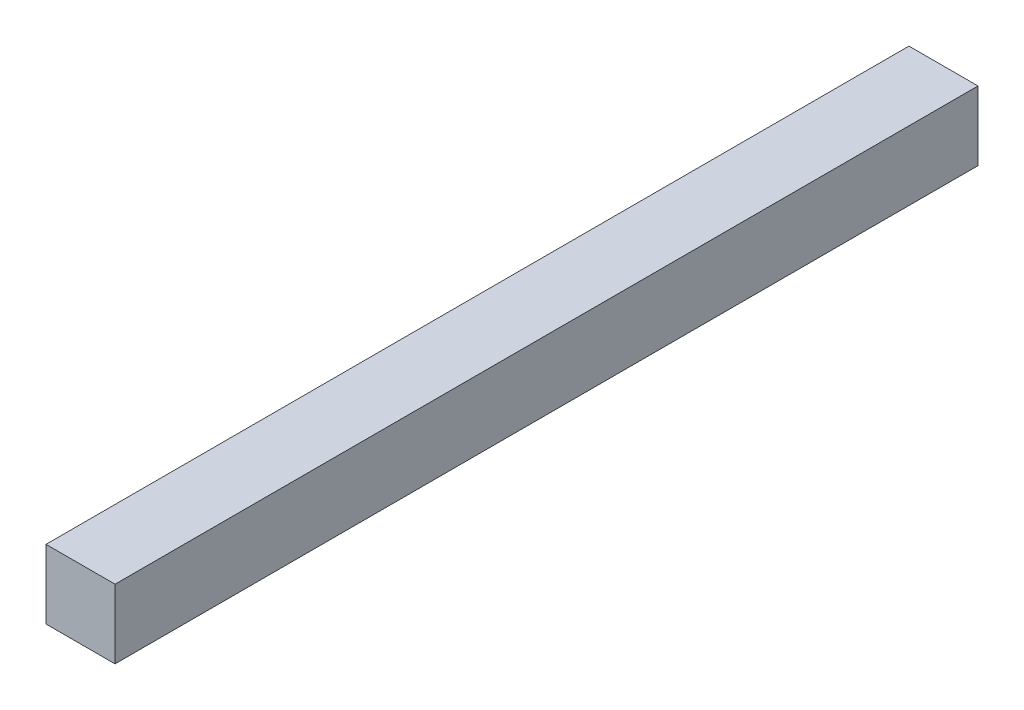
ISO-10303-21;
HEADER;
FILE_DESCRIPTION(('STEP AP214'),'2;1');
FILE_NAME('part.step','',(''),(''),'','','');
FILE_SCHEMA(('AUTOMOTIVE_DESIGN { 1 0 10303 214 1 1 1 1 }'));
ENDSEC;
DATA;
#1=APPLICATION_CONTEXT('core data for automotive mechanical design processes');
#2=APPLICATION_PROTOCOL_DEFINITION('international standard','automotive_design',2000,#1);
#3=PRODUCT_CONTEXT('',#1,'mechanical');
#4=PRODUCT('Part','Part','',(#3));
#5=PRODUCT_RELATED_PRODUCT_CATEGORY('part','',(#4));
#6=PRODUCT_DEFINITION_FORMATION('','',#4);
#7=PRODUCT_DEFINITION_CONTEXT('part definition',#1,'design');
#8=PRODUCT_DEFINITION('design','',#6,#7);
#9=PRODUCT_DEFINITION_SHAPE('','',#8);
#10=(LENGTH_UNIT() NAMED_UNIT(*) SI_UNIT(.MILLI.,.METRE.));
#11=(NAMED_UNIT(*) PLANE_ANGLE_UNIT() SI_UNIT($,.RADIAN.));
#12=(NAMED_UNIT(*) SI_UNIT($,.STERADIAN.) SOLID_ANGLE_UNIT());
#13=UNCERTAINTY_MEASURE_WITH_UNIT(LENGTH_MEASURE(1.E-05),#10,'distance_accuracy_value','');
#14=(GEOMETRIC_REPRESENTATION_CONTEXT(3) GLOBAL_UNCERTAINTY_ASSIGNED_CONTEXT((#13)) GLOBAL_UNIT_ASSIGNED_CONTEXT((#10,
#11,#12)) REPRESENTATION_CONTEXT('',''));
#15=CARTESIAN_POINT('',(0.,0.,0.));
#16=DIRECTION('',(0.,0.,1.));
#17=DIRECTION('',(1.,0.,0.));
#18=AXIS2_PLACEMENT_3D('',#15,#16,#17);
#19=CARTESIAN_POINT('',(8.,-8.,200.));
#20=DIRECTION('',(-1.,0.,0.));
#21=DIRECTION('',(0.,0.,1.));
#22=AXIS2_PLACEMENT_3D('',#19,#20,#21);
#23=PLANE('',#22);
#24=DIRECTION('',(0.,1.,0.));
#25=VECTOR('',#24,1.);
#26=CARTESIAN_POINT('',(8.,-8.,0.));
#27=LINE('',#26,#25);
#28=CARTESIAN_POINT('',(8.,-8.,0.));
#29=VERTEX_POINT('',#28);
#30=CARTESIAN_POINT('',(8.,8.,0.));
#31=VERTEX_POINT('',#30);
#32=EDGE_CURVE('E105',#29,#31,#27,.T.);
#33=ORIENTED_EDGE('',*,*,#32,.T.);
#34=DIRECTION('',(0.,0.,-1.));
#35=VECTOR('',#34,1.);
#36=CARTESIAN_POINT('',(8.,8.,200.));
#37=LINE('',#36,#35);
#38=CARTESIAN_POINT('',(8.,8.,200.));
#39=VERTEX_POINT('',#38);
#40=EDGE_CURVE('E11',#39,#31,#37,.T.);
#41=ORIENTED_EDGE('',*,*,#40,.F.);
#42=DIRECTION('',(0.,1.,0.));
#43=VECTOR('',#42,1.);
#44=CARTESIAN_POINT('',(8.,-8.,200.));
#45=LINE('',#44,#43);
#46=CARTESIAN_POINT('',(8.,-8.,200.));
#47=VERTEX_POINT('',#46);
#48=EDGE_CURVE('E89',#47,#39,#45,.T.);
#49=ORIENTED_EDGE('',*,*,#48,.F.);
#50=DIRECTION('',(0.,0.,-1.));
#51=VECTOR('',#50,1.);
#52=CARTESIAN_POINT('',(8.,-8.,200.));
#53=LINE('',#52,#51);
#54=EDGE_CURVE('E97',#47,#29,#53,.T.);
#55=ORIENTED_EDGE('',*,*,#54,.T.);
#56=EDGE_LOOP('',(#33,#41,#49,#55));
#57=FACE_BOUND('',#56,.T.);
#58=ADVANCED_FACE('F39',(#57),#23,.F.);
#59=CARTESIAN_POINT('',(-8.,8.,200.));
#60=DIRECTION('',(0.,-1.,0.));
#61=DIRECTION('',(0.,0.,-1.));
#62=AXIS2_PLACEMENT_3D('',#59,#60,#61);
#63=PLANE('',#62);
#64=DIRECTION('',(-1.,0.,0.));
#65=VECTOR('',#64,1.);
#66=CARTESIAN_POINT('',(-8.,8.,0.));
#67=LINE('',#66,#65);
#68=CARTESIAN_POINT('',(-8.,8.,0.));
#69=VERTEX_POINT('',#68);
#70=EDGE_CURVE('E92',#31,#69,#67,.T.);
#71=ORIENTED_EDGE('',*,*,#70,.T.);
#72=DIRECTION('',(0.,0.,-1.));
#73=VECTOR('',#72,1.);
#74=CARTESIAN_POINT('',(-8.,8.,200.));
#75=LINE('',#74,#73);
#76=CARTESIAN_POINT('',(-8.,8.,200.));
#77=VERTEX_POINT('',#76);
#78=EDGE_CURVE('E50',#77,#69,#75,.T.);
#79=ORIENTED_EDGE('',*,*,#78,.F.);
#80=DIRECTION('',(-1.,0.,0.));
#81=VECTOR('',#80,1.);
#82=CARTESIAN_POINT('',(-8.,8.,200.));
#83=LINE('',#82,#81);
#84=EDGE_CURVE('E82',#39,#77,#83,.T.);
#85=ORIENTED_EDGE('',*,*,#84,.F.);
#86=ORIENTED_EDGE('',*,*,#40,.T.);
#87=EDGE_LOOP('',(#71,#79,#85,#86));
#88=FACE_BOUND('',#87,.T.);
#89=ADVANCED_FACE('F93',(#88),#63,.F.);
#90=CARTESIAN_POINT('',(-8.,-8.,200.));
#91=DIRECTION('',(1.,0.,0.));
#92=DIRECTION('',(0.,0.,-1.));
#93=AXIS2_PLACEMENT_3D('',#90,#91,#92);
#94=PLANE('',#93);
#95=DIRECTION('',(0.,-1.,0.));
#96=VECTOR('',#95,1.);
#97=CARTESIAN_POINT('',(-8.,-8.,0.));
#98=LINE('',#97,#96);
#99=CARTESIAN_POINT('',(-8.,-8.,0.));
#100=VERTEX_POINT('',#99);
#101=EDGE_CURVE('E72',#69,#100,#98,.T.);
#102=ORIENTED_EDGE('',*,*,#101,.T.);
#103=DIRECTION('',(0.,0.,-1.));
#104=VECTOR('',#103,1.);
#105=CARTESIAN_POINT('',(-8.,-8.,200.));
#106=LINE('',#105,#104);
#107=CARTESIAN_POINT('',(-8.,-8.,200.));
#108=VERTEX_POINT('',#107);
#109=EDGE_CURVE('E94',#108,#100,#106,.T.);
#110=ORIENTED_EDGE('',*,*,#109,.F.);
#111=DIRECTION('',(0.,-1.,0.));
#112=VECTOR('',#111,1.);
#113=CARTESIAN_POINT('',(-8.,-8.,200.));
#114=LINE('',#113,#112);
#115=EDGE_CURVE('E88',#77,#108,#114,.T.);
#116=ORIENTED_EDGE('',*,*,#115,.F.);
#117=ORIENTED_EDGE('',*,*,#78,.T.);
#118=EDGE_LOOP('',(#102,#110,#116,#117));
#119=FACE_BOUND('',#118,.T.);
#120=ADVANCED_FACE('F96',(#119),#94,.F.);
#121=CARTESIAN_POINT('',(-8.,-8.,200.));
#122=DIRECTION('',(0.,1.,0.));
#123=DIRECTION('',(0.,0.,1.));
#124=AXIS2_PLACEMENT_3D('',#121,#122,#123);
#125=PLANE('',#124);
#126=DIRECTION('',(1.,0.,0.));
#127=VECTOR('',#126,1.);
#128=CARTESIAN_POINT('',(-8.,-8.,0.));
#129=LINE('',#128,#127);
#130=EDGE_CURVE('E76',#100,#29,#129,.T.);
#131=ORIENTED_EDGE('',*,*,#130,.T.);
#132=ORIENTED_EDGE('',*,*,#54,.F.);
#133=DIRECTION('',(1.,0.,0.));
#134=VECTOR('',#133,1.);
#135=CARTESIAN_POINT('',(-8.,-8.,200.));
#136=LINE('',#135,#134);
#137=EDGE_CURVE('E54',#108,#47,#136,.T.);
#138=ORIENTED_EDGE('',*,*,#137,.F.);
#139=ORIENTED_EDGE('',*,*,#109,.T.);
#140=EDGE_LOOP('',(#131,#132,#138,#139));
#141=FACE_BOUND('',#140,.T.);
#142=ADVANCED_FACE('F108',(#141),#125,.F.);
#143=CARTESIAN_POINT('',(0.,0.,200.));
#144=DIRECTION('',(0.,0.,-1.));
#145=DIRECTION('',(-1.,0.,0.));
#146=AXIS2_PLACEMENT_3D('',#143,#144,#145);
#147=PLANE('',#146);
#148=ORIENTED_EDGE('',*,*,#48,.T.);
#149=ORIENTED_EDGE('',*,*,#84,.T.);
#150=ORIENTED_EDGE('',*,*,#115,.T.);
#151=ORIENTED_EDGE('',*,*,#137,.T.);
#152=EDGE_LOOP('',(#148,#149,#150,#151));
#153=FACE_BOUND('',#152,.T.);
#154=ADVANCED_FACE('F86',(#153),#147,.F.);
#155=CARTESIAN_POINT('',(0.,0.,0.));
#156=DIRECTION('',(0.,0.,-1.));
#157=DIRECTION('',(-1.,0.,0.));
#158=AXIS2_PLACEMENT_3D('',#155,#156,#157);
#159=PLANE('',#158);
#160=ORIENTED_EDGE('',*,*,#32,.F.);
#161=ORIENTED_EDGE('',*,*,#130,.F.);
#162=ORIENTED_EDGE('',*,*,#101,.F.);
#163=ORIENTED_EDGE('',*,*,#70,.F.);
#164=EDGE_LOOP('',(#160,#161,#162,#163));
#165=FACE_BOUND('',#164,.T.);
#166=ADVANCED_FACE('F115',(#165),#159,.T.);
#167=CLOSED_SHELL('',(#58,#89,#120,#142,#154,#166));
#168=MANIFOLD_SOLID_BREP('B2',#167);
#169=ADVANCED_BREP_SHAPE_REPRESENTATION('',(#18,#168),#14);
#170=SHAPE_DEFINITION_REPRESENTATION(#9,#169);
ENDSEC;
END-ISO-10303-21;
